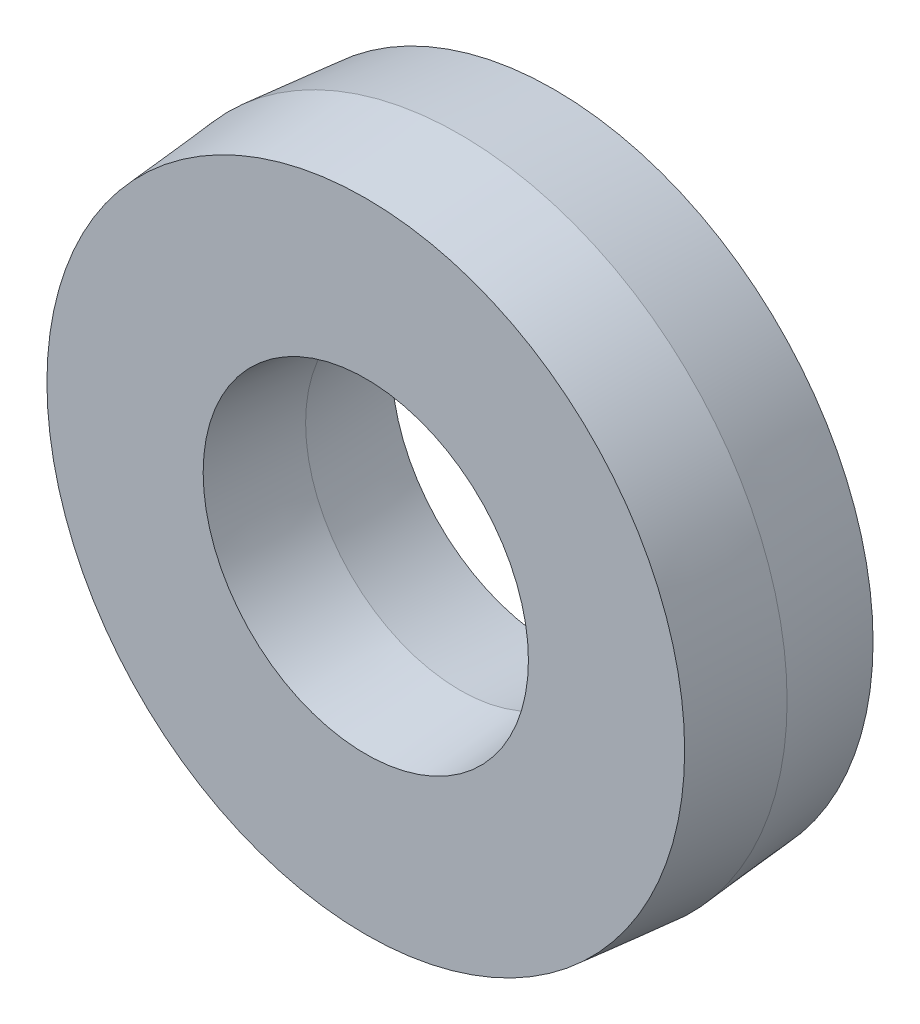
ISO-10303-21;
HEADER;
FILE_DESCRIPTION(('STEP AP214'),'2;1');
FILE_NAME('part.step','',(''),(''),'','','');
FILE_SCHEMA(('AUTOMOTIVE_DESIGN { 1 0 10303 214 1 1 1 1 }'));
ENDSEC;
DATA;
#1=APPLICATION_CONTEXT('core data for automotive mechanical design processes');
#2=APPLICATION_PROTOCOL_DEFINITION('international standard','automotive_design',2000,#1);
#3=PRODUCT_CONTEXT('',#1,'mechanical');
#4=PRODUCT('Part','Part','',(#3));
#5=PRODUCT_RELATED_PRODUCT_CATEGORY('part','',(#4));
#6=PRODUCT_DEFINITION_FORMATION('','',#4);
#7=PRODUCT_DEFINITION_CONTEXT('part definition',#1,'design');
#8=PRODUCT_DEFINITION('design','',#6,#7);
#9=PRODUCT_DEFINITION_SHAPE('','',#8);
#10=(LENGTH_UNIT() NAMED_UNIT(*) SI_UNIT(.MILLI.,.METRE.));
#11=(NAMED_UNIT(*) PLANE_ANGLE_UNIT() SI_UNIT($,.RADIAN.));
#12=(NAMED_UNIT(*) SI_UNIT($,.STERADIAN.) SOLID_ANGLE_UNIT());
#13=UNCERTAINTY_MEASURE_WITH_UNIT(LENGTH_MEASURE(1.E-05),#10,'distance_accuracy_value','');
#14=(GEOMETRIC_REPRESENTATION_CONTEXT(3) GLOBAL_UNCERTAINTY_ASSIGNED_CONTEXT((#13)) GLOBAL_UNIT_ASSIGNED_CONTEXT((#10,
#11,#12)) REPRESENTATION_CONTEXT('',''));
#15=CARTESIAN_POINT('',(0.,0.,0.));
#16=DIRECTION('',(0.,0.,1.));
#17=DIRECTION('',(1.,0.,0.));
#18=AXIS2_PLACEMENT_3D('',#15,#16,#17);
#19=CARTESIAN_POINT('',(0.,0.,0.));
#20=DIRECTION('',(0.,0.,1.));
#21=DIRECTION('',(1.,0.,0.));
#22=AXIS2_PLACEMENT_3D('',#19,#20,#21);
#23=CONICAL_SURFACE('',#22,62.5,0.0872664625997167);
#24=CARTESIAN_POINT('',(0.,0.,-18.));
#25=DIRECTION('',(0.,0.,1.));
#26=DIRECTION('',(1.,0.,0.));
#27=AXIS2_PLACEMENT_3D('',#24,#25,#26);
#28=CIRCLE('',#27,60.9252040565334);
#29=CARTESIAN_POINT('',(60.9252040565334,0.,-18.));
#30=VERTEX_POINT('',#29);
#31=EDGE_CURVE('E10',#30,#30,#28,.T.);
#32=ORIENTED_EDGE('',*,*,#31,.T.);
#33=EDGE_LOOP('',(#32));
#34=FACE_BOUND('',#33,.T.);
#35=CARTESIAN_POINT('',(0.,0.,0.));
#36=DIRECTION('',(0.,0.,1.));
#37=DIRECTION('',(1.,0.,0.));
#38=AXIS2_PLACEMENT_3D('',#35,#36,#37);
#39=CIRCLE('',#38,62.5);
#40=CARTESIAN_POINT('',(62.5,0.,0.));
#41=VERTEX_POINT('',#40);
#42=EDGE_CURVE('E41',#41,#41,#39,.T.);
#43=ORIENTED_EDGE('',*,*,#42,.F.);
#44=EDGE_LOOP('',(#43));
#45=FACE_BOUND('',#44,.T.);
#46=ADVANCED_FACE('F35',(#34,#45),#23,.T.);
#47=CARTESIAN_POINT('',(0.,0.,-18.));
#48=DIRECTION('',(0.,0.,1.));
#49=DIRECTION('',(1.,0.,0.));
#50=AXIS2_PLACEMENT_3D('',#47,#48,#49);
#51=PLANE('',#50);
#52=CARTESIAN_POINT('',(0.,0.,-18.));
#53=DIRECTION('',(0.,0.,1.));
#54=DIRECTION('',(1.,0.,0.));
#55=AXIS2_PLACEMENT_3D('',#52,#53,#54);
#56=CIRCLE('',#55,31.0747959434666);
#57=CARTESIAN_POINT('',(31.0747959434666,0.,-18.));
#58=VERTEX_POINT('',#57);
#59=EDGE_CURVE('E45',#58,#58,#56,.T.);
#60=ORIENTED_EDGE('',*,*,#59,.T.);
#61=EDGE_LOOP('',(#60));
#62=FACE_BOUND('',#61,.T.);
#63=ORIENTED_EDGE('',*,*,#31,.F.);
#64=EDGE_LOOP('',(#63));
#65=FACE_BOUND('',#64,.T.);
#66=ADVANCED_FACE('F76',(#62,#65),#51,.F.);
#67=CARTESIAN_POINT('',(0.,0.,0.));
#68=DIRECTION('',(0.,0.,-1.));
#69=DIRECTION('',(1.,0.,0.));
#70=AXIS2_PLACEMENT_3D('',#67,#68,#69);
#71=CONICAL_SURFACE('',#70,29.5,0.0872664625997167);
#72=ORIENTED_EDGE('',*,*,#59,.F.);
#73=EDGE_LOOP('',(#72));
#74=FACE_BOUND('',#73,.T.);
#75=CARTESIAN_POINT('',(0.,0.,0.));
#76=DIRECTION('',(0.,0.,1.));
#77=DIRECTION('',(1.,0.,0.));
#78=AXIS2_PLACEMENT_3D('',#75,#76,#77);
#79=CIRCLE('',#78,29.5);
#80=CARTESIAN_POINT('',(29.5,0.,0.));
#81=VERTEX_POINT('',#80);
#82=EDGE_CURVE('E55',#81,#81,#79,.T.);
#83=ORIENTED_EDGE('',*,*,#82,.T.);
#84=EDGE_LOOP('',(#83));
#85=FACE_BOUND('',#84,.T.);
#86=ADVANCED_FACE('F61',(#74,#85),#71,.F.);
#87=CARTESIAN_POINT('',(0.,0.,18.));
#88=DIRECTION('',(0.,0.,1.));
#89=DIRECTION('',(1.,0.,0.));
#90=AXIS2_PLACEMENT_3D('',#87,#88,#89);
#91=PLANE('',#90);
#92=CARTESIAN_POINT('',(0.,0.,18.));
#93=DIRECTION('',(0.,0.,1.));
#94=DIRECTION('',(1.,0.,0.));
#95=AXIS2_PLACEMENT_3D('',#92,#93,#94);
#96=CIRCLE('',#95,60.9252040565334);
#97=CARTESIAN_POINT('',(60.9252040565334,0.,18.));
#98=VERTEX_POINT('',#97);
#99=EDGE_CURVE('E50',#98,#98,#96,.T.);
#100=ORIENTED_EDGE('',*,*,#99,.T.);
#101=EDGE_LOOP('',(#100));
#102=FACE_BOUND('',#101,.T.);
#103=CARTESIAN_POINT('',(0.,0.,18.));
#104=DIRECTION('',(0.,0.,1.));
#105=DIRECTION('',(1.,0.,0.));
#106=AXIS2_PLACEMENT_3D('',#103,#104,#105);
#107=CIRCLE('',#106,31.0747959434666);
#108=CARTESIAN_POINT('',(31.0747959434666,0.,18.));
#109=VERTEX_POINT('',#108);
#110=EDGE_CURVE('E52',#109,#109,#107,.T.);
#111=ORIENTED_EDGE('',*,*,#110,.F.);
#112=EDGE_LOOP('',(#111));
#113=FACE_BOUND('',#112,.T.);
#114=ADVANCED_FACE('F71',(#102,#113),#91,.T.);
#115=CARTESIAN_POINT('',(0.,0.,0.));
#116=DIRECTION('',(0.,0.,-1.));
#117=DIRECTION('',(1.,0.,0.));
#118=AXIS2_PLACEMENT_3D('',#115,#116,#117);
#119=CONICAL_SURFACE('',#118,62.5,0.0872664625997167);
#120=ORIENTED_EDGE('',*,*,#99,.F.);
#121=EDGE_LOOP('',(#120));
#122=FACE_BOUND('',#121,.T.);
#123=ORIENTED_EDGE('',*,*,#42,.T.);
#124=EDGE_LOOP('',(#123));
#125=FACE_BOUND('',#124,.T.);
#126=ADVANCED_FACE('F65',(#122,#125),#119,.T.);
#127=CARTESIAN_POINT('',(0.,0.,0.));
#128=DIRECTION('',(0.,0.,1.));
#129=DIRECTION('',(1.,0.,0.));
#130=AXIS2_PLACEMENT_3D('',#127,#128,#129);
#131=CONICAL_SURFACE('',#130,29.5,0.0872664625997167);
#132=ORIENTED_EDGE('',*,*,#110,.T.);
#133=EDGE_LOOP('',(#132));
#134=FACE_BOUND('',#133,.T.);
#135=ORIENTED_EDGE('',*,*,#82,.F.);
#136=EDGE_LOOP('',(#135));
#137=FACE_BOUND('',#136,.T.);
#138=ADVANCED_FACE('F63',(#134,#137),#131,.F.);
#139=CLOSED_SHELL('',(#46,#66,#86,#114,#126,#138));
#140=MANIFOLD_SOLID_BREP('B2',#139);
#141=ADVANCED_BREP_SHAPE_REPRESENTATION('',(#18,#140),#14);
#142=SHAPE_DEFINITION_REPRESENTATION(#9,#141);
ENDSEC;
END-ISO-10303-21;
